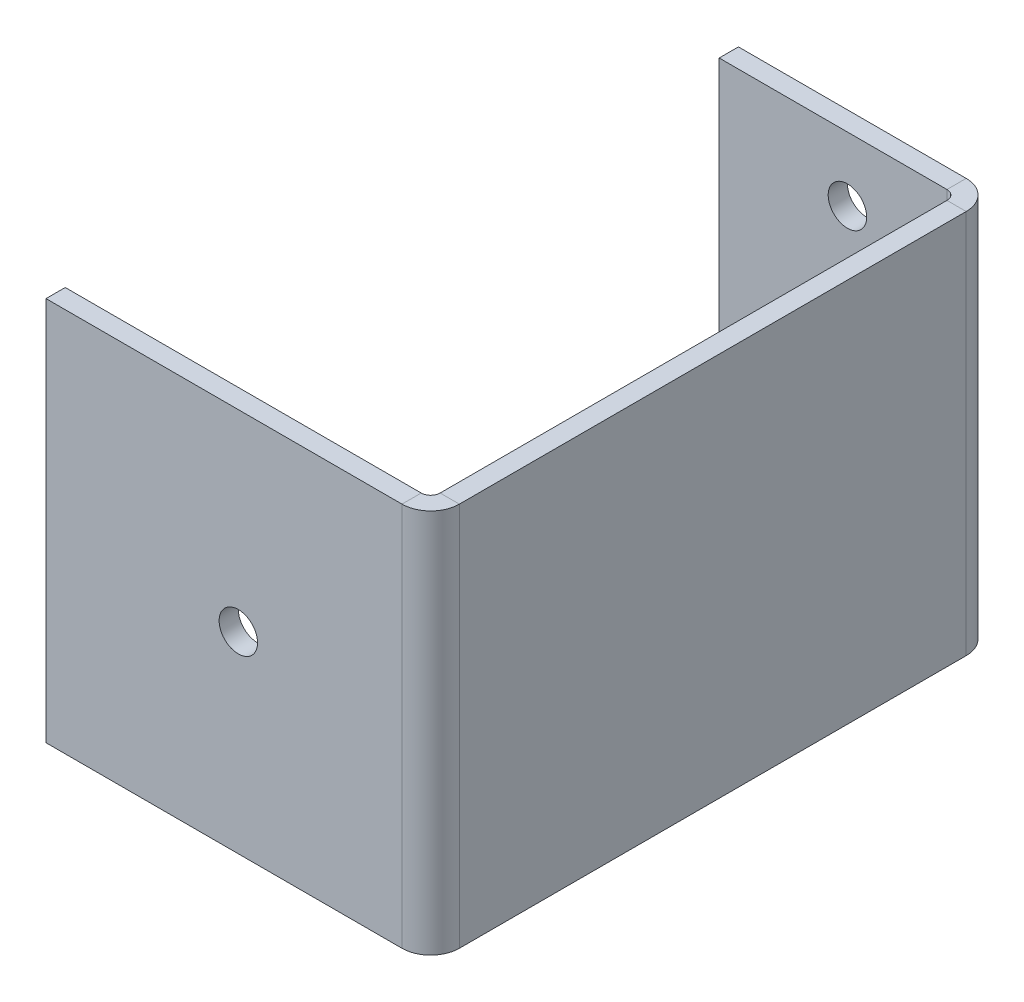
ISO-10303-21;
HEADER;
FILE_DESCRIPTION(('STEP AP214'),'2;1');
FILE_NAME('part.step','',(''),(''),'','','');
FILE_SCHEMA(('AUTOMOTIVE_DESIGN { 1 0 10303 214 1 1 1 1 }'));
ENDSEC;
DATA;
#1=APPLICATION_CONTEXT('core data for automotive mechanical design processes');
#2=APPLICATION_PROTOCOL_DEFINITION('international standard','automotive_design',2000,#1);
#3=PRODUCT_CONTEXT('',#1,'mechanical');
#4=PRODUCT('Part','Part','',(#3));
#5=PRODUCT_RELATED_PRODUCT_CATEGORY('part','',(#4));
#6=PRODUCT_DEFINITION_FORMATION('','',#4);
#7=PRODUCT_DEFINITION_CONTEXT('part definition',#1,'design');
#8=PRODUCT_DEFINITION('design','',#6,#7);
#9=PRODUCT_DEFINITION_SHAPE('','',#8);
#10=(LENGTH_UNIT() NAMED_UNIT(*) SI_UNIT(.MILLI.,.METRE.));
#11=(NAMED_UNIT(*) PLANE_ANGLE_UNIT() SI_UNIT($,.RADIAN.));
#12=(NAMED_UNIT(*) SI_UNIT($,.STERADIAN.) SOLID_ANGLE_UNIT());
#13=UNCERTAINTY_MEASURE_WITH_UNIT(LENGTH_MEASURE(1.E-05),#10,'distance_accuracy_value','');
#14=(GEOMETRIC_REPRESENTATION_CONTEXT(3) GLOBAL_UNCERTAINTY_ASSIGNED_CONTEXT((#13)) GLOBAL_UNIT_ASSIGNED_CONTEXT((#10,
#11,#12)) REPRESENTATION_CONTEXT('',''));
#15=CARTESIAN_POINT('',(0.,0.,0.));
#16=DIRECTION('',(0.,0.,1.));
#17=DIRECTION('',(1.,0.,0.));
#18=AXIS2_PLACEMENT_3D('',#15,#16,#17);
#19=CARTESIAN_POINT('',(20.,30.,2.2366));
#20=DIRECTION('',(0.,1.,0.));
#21=DIRECTION('',(0.,0.,1.));
#22=AXIS2_PLACEMENT_3D('',#19,#20,#21);
#23=PLANE('',#22);
#24=DIRECTION('',(-1.,0.,0.));
#25=VECTOR('',#24,1.);
#26=CARTESIAN_POINT('',(20.,30.,2.2366));
#27=LINE('',#26,#25);
#28=CARTESIAN_POINT('',(20.,30.,2.2366));
#29=VERTEX_POINT('',#28);
#30=CARTESIAN_POINT('',(18.5,30.,2.2366));
#31=VERTEX_POINT('',#30);
#32=EDGE_CURVE('E11',#29,#31,#27,.T.);
#33=ORIENTED_EDGE('',*,*,#32,.F.);
#34=CARTESIAN_POINT('',(17.7634,30.,2.2366));
#35=DIRECTION('',(0.,1.,0.));
#36=DIRECTION('',(0.,0.,1.));
#37=AXIS2_PLACEMENT_3D('',#34,#35,#36);
#38=CIRCLE('',#37,2.2366);
#39=CARTESIAN_POINT('',(17.7634,30.,0.));
#40=VERTEX_POINT('',#39);
#41=EDGE_CURVE('E247',#40,#29,#38,.F.);
#42=ORIENTED_EDGE('',*,*,#41,.F.);
#43=DIRECTION('',(0.,0.,-1.));
#44=VECTOR('',#43,1.);
#45=CARTESIAN_POINT('',(17.7634,30.,1.5));
#46=LINE('',#45,#44);
#47=CARTESIAN_POINT('',(17.7634,30.,1.5));
#48=VERTEX_POINT('',#47);
#49=EDGE_CURVE('E44',#48,#40,#46,.T.);
#50=ORIENTED_EDGE('',*,*,#49,.F.);
#51=CARTESIAN_POINT('',(17.7634,30.,2.2366));
#52=DIRECTION('',(0.,1.,0.));
#53=DIRECTION('',(1.,0.,0.));
#54=AXIS2_PLACEMENT_3D('',#51,#52,#53);
#55=CIRCLE('',#54,0.7366);
#56=EDGE_CURVE('E145',#48,#31,#55,.F.);
#57=ORIENTED_EDGE('',*,*,#56,.T.);
#58=EDGE_LOOP('',(#33,#42,#50,#57));
#59=FACE_BOUND('',#58,.T.);
#60=ADVANCED_FACE('F36',(#59),#23,.T.);
#61=CARTESIAN_POINT('',(17.7634,30.,1.5));
#62=DIRECTION('',(0.,1.,0.));
#63=DIRECTION('',(0.,0.,1.));
#64=AXIS2_PLACEMENT_3D('',#61,#62,#63);
#65=PLANE('',#64);
#66=DIRECTION('',(0.,0.,1.));
#67=VECTOR('',#66,1.);
#68=CARTESIAN_POINT('',(20.,30.,0.));
#69=LINE('',#68,#67);
#70=CARTESIAN_POINT('',(20.,30.,41.7634));
#71=VERTEX_POINT('',#70);
#72=EDGE_CURVE('E139',#29,#71,#69,.T.);
#73=ORIENTED_EDGE('',*,*,#72,.F.);
#74=ORIENTED_EDGE('',*,*,#32,.T.);
#75=DIRECTION('',(0.,0.,1.));
#76=VECTOR('',#75,1.);
#77=CARTESIAN_POINT('',(18.5,30.,0.));
#78=LINE('',#77,#76);
#79=CARTESIAN_POINT('',(18.5,30.,41.7634));
#80=VERTEX_POINT('',#79);
#81=EDGE_CURVE('E136',#31,#80,#78,.T.);
#82=ORIENTED_EDGE('',*,*,#81,.T.);
#83=DIRECTION('',(1.,0.,0.));
#84=VECTOR('',#83,1.);
#85=CARTESIAN_POINT('',(18.5,30.,41.7634));
#86=LINE('',#85,#84);
#87=EDGE_CURVE('E228',#80,#71,#86,.T.);
#88=ORIENTED_EDGE('',*,*,#87,.T.);
#89=EDGE_LOOP('',(#73,#74,#82,#88));
#90=FACE_BOUND('',#89,.T.);
#91=ADVANCED_FACE('F134',(#90),#65,.T.);
#92=CARTESIAN_POINT('',(17.7634,0.,0.));
#93=DIRECTION('',(0.,-1.,0.));
#94=DIRECTION('',(0.,0.,-1.));
#95=AXIS2_PLACEMENT_3D('',#92,#93,#94);
#96=PLANE('',#95);
#97=DIRECTION('',(0.,0.,1.));
#98=VECTOR('',#97,1.);
#99=CARTESIAN_POINT('',(17.7634,0.,0.));
#100=LINE('',#99,#98);
#101=CARTESIAN_POINT('',(17.7634,0.,0.));
#102=VERTEX_POINT('',#101);
#103=CARTESIAN_POINT('',(17.7634,0.,1.5));
#104=VERTEX_POINT('',#103);
#105=EDGE_CURVE('E233',#102,#104,#100,.T.);
#106=ORIENTED_EDGE('',*,*,#105,.F.);
#107=CARTESIAN_POINT('',(17.7634,0.,2.2366));
#108=DIRECTION('',(0.,1.,0.));
#109=DIRECTION('',(0.,0.,1.));
#110=AXIS2_PLACEMENT_3D('',#107,#108,#109);
#111=CIRCLE('',#110,2.2366);
#112=CARTESIAN_POINT('',(20.,0.,2.2366));
#113=VERTEX_POINT('',#112);
#114=EDGE_CURVE('E185',#102,#113,#111,.F.);
#115=ORIENTED_EDGE('',*,*,#114,.T.);
#116=DIRECTION('',(1.,0.,0.));
#117=VECTOR('',#116,1.);
#118=CARTESIAN_POINT('',(18.5,0.,2.2366));
#119=LINE('',#118,#117);
#120=CARTESIAN_POINT('',(18.5,0.,2.2366));
#121=VERTEX_POINT('',#120);
#122=EDGE_CURVE('E231',#121,#113,#119,.T.);
#123=ORIENTED_EDGE('',*,*,#122,.F.);
#124=CARTESIAN_POINT('',(17.7634,0.,2.2366));
#125=DIRECTION('',(0.,1.,0.));
#126=DIRECTION('',(1.,0.,0.));
#127=AXIS2_PLACEMENT_3D('',#124,#125,#126);
#128=CIRCLE('',#127,0.7366);
#129=EDGE_CURVE('E157',#104,#121,#128,.F.);
#130=ORIENTED_EDGE('',*,*,#129,.F.);
#131=EDGE_LOOP('',(#106,#115,#123,#130));
#132=FACE_BOUND('',#131,.T.);
#133=ADVANCED_FACE('F307',(#132),#96,.T.);
#134=CARTESIAN_POINT('',(18.5,0.,2.2366));
#135=DIRECTION('',(0.,-1.,0.));
#136=DIRECTION('',(0.,0.,-1.));
#137=AXIS2_PLACEMENT_3D('',#134,#135,#136);
#138=PLANE('',#137);
#139=DIRECTION('',(1.,0.,0.));
#140=VECTOR('',#139,1.);
#141=CARTESIAN_POINT('',(0.,0.,0.));
#142=LINE('',#141,#140);
#143=CARTESIAN_POINT('',(0.,0.,0.));
#144=VERTEX_POINT('',#143);
#145=EDGE_CURVE('E188',#144,#102,#142,.T.);
#146=ORIENTED_EDGE('',*,*,#145,.T.);
#147=ORIENTED_EDGE('',*,*,#105,.T.);
#148=DIRECTION('',(1.,0.,0.));
#149=VECTOR('',#148,1.);
#150=CARTESIAN_POINT('',(0.,0.,1.5));
#151=LINE('',#150,#149);
#152=CARTESIAN_POINT('',(0.,0.,1.5));
#153=VERTEX_POINT('',#152);
#154=EDGE_CURVE('E194',#153,#104,#151,.T.);
#155=ORIENTED_EDGE('',*,*,#154,.F.);
#156=DIRECTION('',(0.,0.,-1.));
#157=VECTOR('',#156,1.);
#158=CARTESIAN_POINT('',(0.,0.,1.5));
#159=LINE('',#158,#157);
#160=EDGE_CURVE('E191',#153,#144,#159,.T.);
#161=ORIENTED_EDGE('',*,*,#160,.T.);
#162=EDGE_LOOP('',(#146,#147,#155,#161));
#163=FACE_BOUND('',#162,.T.);
#164=ADVANCED_FACE('F310',(#163),#138,.T.);
#165=CARTESIAN_POINT('',(17.7634,30.,44.));
#166=DIRECTION('',(0.,1.,0.));
#167=DIRECTION('',(0.,0.,1.));
#168=AXIS2_PLACEMENT_3D('',#165,#166,#167);
#169=PLANE('',#168);
#170=DIRECTION('',(0.,0.,-1.));
#171=VECTOR('',#170,1.);
#172=CARTESIAN_POINT('',(17.7634,30.,44.));
#173=LINE('',#172,#171);
#174=CARTESIAN_POINT('',(17.7634,30.,44.));
#175=VERTEX_POINT('',#174);
#176=CARTESIAN_POINT('',(17.7634,30.,42.5));
#177=VERTEX_POINT('',#176);
#178=EDGE_CURVE('E52',#175,#177,#173,.T.);
#179=ORIENTED_EDGE('',*,*,#178,.F.);
#180=CARTESIAN_POINT('',(17.7634,30.,41.7634));
#181=DIRECTION('',(0.,1.,0.));
#182=DIRECTION('',(0.,0.,1.));
#183=AXIS2_PLACEMENT_3D('',#180,#181,#182);
#184=CIRCLE('',#183,2.2366);
#185=EDGE_CURVE('E257',#71,#175,#184,.F.);
#186=ORIENTED_EDGE('',*,*,#185,.F.);
#187=ORIENTED_EDGE('',*,*,#87,.F.);
#188=CARTESIAN_POINT('',(17.7634,30.,41.7634));
#189=DIRECTION('',(0.,1.,0.));
#190=DIRECTION('',(1.,0.,0.));
#191=AXIS2_PLACEMENT_3D('',#188,#189,#190);
#192=CIRCLE('',#191,0.7366);
#193=EDGE_CURVE('E165',#80,#177,#192,.F.);
#194=ORIENTED_EDGE('',*,*,#193,.T.);
#195=EDGE_LOOP('',(#179,#186,#187,#194));
#196=FACE_BOUND('',#195,.T.);
#197=ADVANCED_FACE('F337',(#196),#169,.T.);
#198=CARTESIAN_POINT('',(18.5,30.,41.7634));
#199=DIRECTION('',(0.,1.,0.));
#200=DIRECTION('',(0.,0.,1.));
#201=AXIS2_PLACEMENT_3D('',#198,#199,#200);
#202=PLANE('',#201);
#203=DIRECTION('',(-1.,0.,0.));
#204=VECTOR('',#203,1.);
#205=CARTESIAN_POINT('',(20.,30.,44.));
#206=LINE('',#205,#204);
#207=CARTESIAN_POINT('',(-9.99999999999998,30.,44.));
#208=VERTEX_POINT('',#207);
#209=EDGE_CURVE('E260',#175,#208,#206,.T.);
#210=ORIENTED_EDGE('',*,*,#209,.F.);
#211=ORIENTED_EDGE('',*,*,#178,.T.);
#212=DIRECTION('',(-1.,0.,0.));
#213=VECTOR('',#212,1.);
#214=CARTESIAN_POINT('',(20.,30.,42.5));
#215=LINE('',#214,#213);
#216=CARTESIAN_POINT('',(-9.99999999999998,30.,42.5));
#217=VERTEX_POINT('',#216);
#218=EDGE_CURVE('E106',#177,#217,#215,.T.);
#219=ORIENTED_EDGE('',*,*,#218,.T.);
#220=DIRECTION('',(0.,0.,-1.));
#221=VECTOR('',#220,1.);
#222=CARTESIAN_POINT('',(-9.99999999999998,30.,44.));
#223=LINE('',#222,#221);
#224=EDGE_CURVE('E263',#208,#217,#223,.T.);
#225=ORIENTED_EDGE('',*,*,#224,.F.);
#226=EDGE_LOOP('',(#210,#211,#219,#225));
#227=FACE_BOUND('',#226,.T.);
#228=ADVANCED_FACE('F340',(#227),#202,.T.);
#229=CARTESIAN_POINT('',(20.,0.,41.7634));
#230=DIRECTION('',(0.,-1.,0.));
#231=DIRECTION('',(0.,0.,-1.));
#232=AXIS2_PLACEMENT_3D('',#229,#230,#231);
#233=PLANE('',#232);
#234=DIRECTION('',(-1.,0.,0.));
#235=VECTOR('',#234,1.);
#236=CARTESIAN_POINT('',(20.,0.,41.7634));
#237=LINE('',#236,#235);
#238=CARTESIAN_POINT('',(20.,0.,41.7634));
#239=VERTEX_POINT('',#238);
#240=CARTESIAN_POINT('',(18.5,0.,41.7634));
#241=VERTEX_POINT('',#240);
#242=EDGE_CURVE('E93',#239,#241,#237,.T.);
#243=ORIENTED_EDGE('',*,*,#242,.F.);
#244=CARTESIAN_POINT('',(17.7634,0.,41.7634));
#245=DIRECTION('',(0.,1.,0.));
#246=DIRECTION('',(0.,0.,1.));
#247=AXIS2_PLACEMENT_3D('',#244,#245,#246);
#248=CIRCLE('',#247,2.2366);
#249=CARTESIAN_POINT('',(17.7634,0.,44.));
#250=VERTEX_POINT('',#249);
#251=EDGE_CURVE('E181',#239,#250,#248,.F.);
#252=ORIENTED_EDGE('',*,*,#251,.T.);
#253=DIRECTION('',(0.,0.,1.));
#254=VECTOR('',#253,1.);
#255=CARTESIAN_POINT('',(17.7634,0.,42.5));
#256=LINE('',#255,#254);
#257=CARTESIAN_POINT('',(17.7634,0.,42.5));
#258=VERTEX_POINT('',#257);
#259=EDGE_CURVE('E100',#258,#250,#256,.T.);
#260=ORIENTED_EDGE('',*,*,#259,.F.);
#261=CARTESIAN_POINT('',(17.7634,0.,41.7634));
#262=DIRECTION('',(0.,1.,0.));
#263=DIRECTION('',(1.,0.,0.));
#264=AXIS2_PLACEMENT_3D('',#261,#262,#263);
#265=CIRCLE('',#264,0.7366);
#266=EDGE_CURVE('E200',#241,#258,#265,.F.);
#267=ORIENTED_EDGE('',*,*,#266,.F.);
#268=EDGE_LOOP('',(#243,#252,#260,#267));
#269=FACE_BOUND('',#268,.T.);
#270=ADVANCED_FACE('F298',(#269),#233,.T.);
#271=CARTESIAN_POINT('',(17.7634,0.,42.5));
#272=DIRECTION('',(0.,-1.,0.));
#273=DIRECTION('',(0.,0.,-1.));
#274=AXIS2_PLACEMENT_3D('',#271,#272,#273);
#275=PLANE('',#274);
#276=DIRECTION('',(0.,0.,1.));
#277=VECTOR('',#276,1.);
#278=CARTESIAN_POINT('',(20.,0.,0.));
#279=LINE('',#278,#277);
#280=EDGE_CURVE('E183',#113,#239,#279,.T.);
#281=ORIENTED_EDGE('',*,*,#280,.T.);
#282=ORIENTED_EDGE('',*,*,#242,.T.);
#283=DIRECTION('',(0.,0.,1.));
#284=VECTOR('',#283,1.);
#285=CARTESIAN_POINT('',(18.5,0.,0.));
#286=LINE('',#285,#284);
#287=EDGE_CURVE('E198',#121,#241,#286,.T.);
#288=ORIENTED_EDGE('',*,*,#287,.F.);
#289=ORIENTED_EDGE('',*,*,#122,.T.);
#290=EDGE_LOOP('',(#281,#282,#288,#289));
#291=FACE_BOUND('',#290,.T.);
#292=ADVANCED_FACE('F303',(#291),#275,.T.);
#293=CARTESIAN_POINT('',(20.,30.,42.5));
#294=DIRECTION('',(0.,0.,1.));
#295=DIRECTION('',(1.,0.,0.));
#296=AXIS2_PLACEMENT_3D('',#293,#294,#295);
#297=PLANE('',#296);
#298=CARTESIAN_POINT('',(5.00000000000001,15.,42.5));
#299=DIRECTION('',(0.,0.,1.));
#300=DIRECTION('',(1.,0.,0.));
#301=AXIS2_PLACEMENT_3D('',#298,#299,#300);
#302=CIRCLE('',#301,1.49999999999999);
#303=CARTESIAN_POINT('',(6.50000000000001,15.,42.5));
#304=VERTEX_POINT('',#303);
#305=EDGE_CURVE('E278',#304,#304,#302,.T.);
#306=ORIENTED_EDGE('',*,*,#305,.T.);
#307=EDGE_LOOP('',(#306));
#308=FACE_BOUND('',#307,.T.);
#309=DIRECTION('',(-1.,0.,0.));
#310=VECTOR('',#309,1.);
#311=CARTESIAN_POINT('',(20.,0.,42.5));
#312=LINE('',#311,#310);
#313=CARTESIAN_POINT('',(-9.99999999999998,0.,42.5));
#314=VERTEX_POINT('',#313);
#315=EDGE_CURVE('E171',#258,#314,#312,.T.);
#316=ORIENTED_EDGE('',*,*,#315,.T.);
#317=DIRECTION('',(0.,-1.,0.));
#318=VECTOR('',#317,1.);
#319=CARTESIAN_POINT('',(-9.99999999999998,30.,42.5));
#320=LINE('',#319,#318);
#321=EDGE_CURVE('E224',#217,#314,#320,.T.);
#322=ORIENTED_EDGE('',*,*,#321,.F.);
#323=ORIENTED_EDGE('',*,*,#218,.F.);
#324=DIRECTION('',(0.,-1.,0.));
#325=VECTOR('',#324,1.);
#326=CARTESIAN_POINT('',(17.7634,30.,42.5));
#327=LINE('',#326,#325);
#328=EDGE_CURVE('E167',#177,#258,#327,.T.);
#329=ORIENTED_EDGE('',*,*,#328,.T.);
#330=EDGE_LOOP('',(#316,#322,#323,#329));
#331=FACE_BOUND('',#330,.T.);
#332=ADVANCED_FACE('F348',(#308,#331),#297,.F.);
#333=CARTESIAN_POINT('',(-9.99999999999998,30.,44.));
#334=DIRECTION('',(-1.,0.,0.));
#335=DIRECTION('',(0.,0.,1.));
#336=AXIS2_PLACEMENT_3D('',#333,#334,#335);
#337=PLANE('',#336);
#338=DIRECTION('',(0.,0.,-1.));
#339=VECTOR('',#338,1.);
#340=CARTESIAN_POINT('',(-9.99999999999998,0.,44.));
#341=LINE('',#340,#339);
#342=CARTESIAN_POINT('',(-9.99999999999998,0.,44.));
#343=VERTEX_POINT('',#342);
#344=EDGE_CURVE('E174',#343,#314,#341,.T.);
#345=ORIENTED_EDGE('',*,*,#344,.F.);
#346=DIRECTION('',(0.,-1.,0.));
#347=VECTOR('',#346,1.);
#348=CARTESIAN_POINT('',(-9.99999999999998,30.,44.));
#349=LINE('',#348,#347);
#350=EDGE_CURVE('E222',#208,#343,#349,.T.);
#351=ORIENTED_EDGE('',*,*,#350,.F.);
#352=ORIENTED_EDGE('',*,*,#224,.T.);
#353=ORIENTED_EDGE('',*,*,#321,.T.);
#354=EDGE_LOOP('',(#345,#351,#352,#353));
#355=FACE_BOUND('',#354,.T.);
#356=ADVANCED_FACE('F291',(#355),#337,.T.);
#357=CARTESIAN_POINT('',(20.,30.,44.));
#358=DIRECTION('',(0.,0.,1.));
#359=DIRECTION('',(1.,0.,0.));
#360=AXIS2_PLACEMENT_3D('',#357,#358,#359);
#361=PLANE('',#360);
#362=CARTESIAN_POINT('',(5.00000000000001,15.,44.));
#363=DIRECTION('',(0.,0.,1.));
#364=DIRECTION('',(1.,0.,0.));
#365=AXIS2_PLACEMENT_3D('',#362,#363,#364);
#366=CIRCLE('',#365,1.49999999999999);
#367=CARTESIAN_POINT('',(6.5,15.,44.));
#368=VERTEX_POINT('',#367);
#369=EDGE_CURVE('E281',#368,#368,#366,.T.);
#370=ORIENTED_EDGE('',*,*,#369,.F.);
#371=EDGE_LOOP('',(#370));
#372=FACE_BOUND('',#371,.T.);
#373=DIRECTION('',(-1.,0.,0.));
#374=VECTOR('',#373,1.);
#375=CARTESIAN_POINT('',(20.,0.,44.));
#376=LINE('',#375,#374);
#377=EDGE_CURVE('E178',#250,#343,#376,.T.);
#378=ORIENTED_EDGE('',*,*,#377,.F.);
#379=DIRECTION('',(0.,-1.,0.));
#380=VECTOR('',#379,1.);
#381=CARTESIAN_POINT('',(17.7634,30.,44.));
#382=LINE('',#381,#380);
#383=EDGE_CURVE('E219',#175,#250,#382,.T.);
#384=ORIENTED_EDGE('',*,*,#383,.F.);
#385=ORIENTED_EDGE('',*,*,#209,.T.);
#386=ORIENTED_EDGE('',*,*,#350,.T.);
#387=EDGE_LOOP('',(#378,#384,#385,#386));
#388=FACE_BOUND('',#387,.T.);
#389=ADVANCED_FACE('F287',(#372,#388),#361,.T.);
#390=CARTESIAN_POINT('',(17.7634,30.,41.7634));
#391=DIRECTION('',(0.,-1.,0.));
#392=DIRECTION('',(0.,0.,-1.));
#393=AXIS2_PLACEMENT_3D('',#390,#391,#392);
#394=CYLINDRICAL_SURFACE('',#393,2.2366);
#395=ORIENTED_EDGE('',*,*,#251,.F.);
#396=DIRECTION('',(0.,-1.,0.));
#397=VECTOR('',#396,1.);
#398=CARTESIAN_POINT('',(20.,30.,41.7634));
#399=LINE('',#398,#397);
#400=EDGE_CURVE('E216',#71,#239,#399,.T.);
#401=ORIENTED_EDGE('',*,*,#400,.F.);
#402=ORIENTED_EDGE('',*,*,#185,.T.);
#403=ORIENTED_EDGE('',*,*,#383,.T.);
#404=EDGE_LOOP('',(#395,#401,#402,#403));
#405=FACE_BOUND('',#404,.T.);
#406=ADVANCED_FACE('F290',(#405),#394,.T.);
#407=CARTESIAN_POINT('',(20.,30.,0.));
#408=DIRECTION('',(1.,0.,0.));
#409=DIRECTION('',(0.,0.,-1.));
#410=AXIS2_PLACEMENT_3D('',#407,#408,#409);
#411=PLANE('',#410);
#412=ORIENTED_EDGE('',*,*,#280,.F.);
#413=DIRECTION('',(0.,-1.,0.));
#414=VECTOR('',#413,1.);
#415=CARTESIAN_POINT('',(20.,30.,2.2366));
#416=LINE('',#415,#414);
#417=EDGE_CURVE('E213',#29,#113,#416,.T.);
#418=ORIENTED_EDGE('',*,*,#417,.F.);
#419=ORIENTED_EDGE('',*,*,#72,.T.);
#420=ORIENTED_EDGE('',*,*,#400,.T.);
#421=EDGE_LOOP('',(#412,#418,#419,#420));
#422=FACE_BOUND('',#421,.T.);
#423=ADVANCED_FACE('F305',(#422),#411,.T.);
#424=CARTESIAN_POINT('',(17.7634,30.,2.2366));
#425=DIRECTION('',(0.,-1.,0.));
#426=DIRECTION('',(0.,0.,-1.));
#427=AXIS2_PLACEMENT_3D('',#424,#425,#426);
#428=CYLINDRICAL_SURFACE('',#427,2.2366);
#429=ORIENTED_EDGE('',*,*,#114,.F.);
#430=DIRECTION('',(0.,-1.,0.));
#431=VECTOR('',#430,1.);
#432=CARTESIAN_POINT('',(17.7634,30.,0.));
#433=LINE('',#432,#431);
#434=EDGE_CURVE('E210',#40,#102,#433,.T.);
#435=ORIENTED_EDGE('',*,*,#434,.F.);
#436=ORIENTED_EDGE('',*,*,#41,.T.);
#437=ORIENTED_EDGE('',*,*,#417,.T.);
#438=EDGE_LOOP('',(#429,#435,#436,#437));
#439=FACE_BOUND('',#438,.T.);
#440=ADVANCED_FACE('F246',(#439),#428,.T.);
#441=CARTESIAN_POINT('',(0.,30.,0.));
#442=DIRECTION('',(0.,0.,-1.));
#443=DIRECTION('',(-1.,0.,0.));
#444=AXIS2_PLACEMENT_3D('',#441,#442,#443);
#445=PLANE('',#444);
#446=CARTESIAN_POINT('',(10.,25.,0.));
#447=DIRECTION('',(0.,0.,-1.));
#448=DIRECTION('',(-1.,0.,0.));
#449=AXIS2_PLACEMENT_3D('',#446,#447,#448);
#450=CIRCLE('',#449,1.5);
#451=CARTESIAN_POINT('',(8.5,25.,0.));
#452=VERTEX_POINT('',#451);
#453=EDGE_CURVE('E275',#452,#452,#450,.T.);
#454=ORIENTED_EDGE('',*,*,#453,.F.);
#455=EDGE_LOOP('',(#454));
#456=FACE_BOUND('',#455,.T.);
#457=CARTESIAN_POINT('',(10.,5.,0.));
#458=DIRECTION('',(0.,0.,-1.));
#459=DIRECTION('',(-1.,0.,0.));
#460=AXIS2_PLACEMENT_3D('',#457,#458,#459);
#461=CIRCLE('',#460,1.5);
#462=CARTESIAN_POINT('',(8.5,5.,0.));
#463=VERTEX_POINT('',#462);
#464=EDGE_CURVE('E269',#463,#463,#461,.T.);
#465=ORIENTED_EDGE('',*,*,#464,.F.);
#466=EDGE_LOOP('',(#465));
#467=FACE_BOUND('',#466,.T.);
#468=ORIENTED_EDGE('',*,*,#145,.F.);
#469=DIRECTION('',(0.,-1.,0.));
#470=VECTOR('',#469,1.);
#471=CARTESIAN_POINT('',(0.,30.,0.));
#472=LINE('',#471,#470);
#473=CARTESIAN_POINT('',(0.,30.,0.));
#474=VERTEX_POINT('',#473);
#475=EDGE_CURVE('E208',#474,#144,#472,.T.);
#476=ORIENTED_EDGE('',*,*,#475,.F.);
#477=DIRECTION('',(1.,0.,0.));
#478=VECTOR('',#477,1.);
#479=CARTESIAN_POINT('',(0.,30.,0.));
#480=LINE('',#479,#478);
#481=EDGE_CURVE('E240',#474,#40,#480,.T.);
#482=ORIENTED_EDGE('',*,*,#481,.T.);
#483=ORIENTED_EDGE('',*,*,#434,.T.);
#484=EDGE_LOOP('',(#468,#476,#482,#483));
#485=FACE_BOUND('',#484,.T.);
#486=ADVANCED_FACE('F251',(#456,#467,#485),#445,.T.);
#487=CARTESIAN_POINT('',(0.,30.,1.5));
#488=DIRECTION('',(-1.,0.,0.));
#489=DIRECTION('',(0.,0.,1.));
#490=AXIS2_PLACEMENT_3D('',#487,#488,#489);
#491=PLANE('',#490);
#492=ORIENTED_EDGE('',*,*,#160,.F.);
#493=DIRECTION('',(0.,-1.,0.));
#494=VECTOR('',#493,1.);
#495=CARTESIAN_POINT('',(0.,30.,1.5));
#496=LINE('',#495,#494);
#497=CARTESIAN_POINT('',(0.,30.,1.5));
#498=VERTEX_POINT('',#497);
#499=EDGE_CURVE('E206',#498,#153,#496,.T.);
#500=ORIENTED_EDGE('',*,*,#499,.F.);
#501=DIRECTION('',(0.,0.,-1.));
#502=VECTOR('',#501,1.);
#503=CARTESIAN_POINT('',(0.,30.,1.5));
#504=LINE('',#503,#502);
#505=EDGE_CURVE('E252',#498,#474,#504,.T.);
#506=ORIENTED_EDGE('',*,*,#505,.T.);
#507=ORIENTED_EDGE('',*,*,#475,.T.);
#508=EDGE_LOOP('',(#492,#500,#506,#507));
#509=FACE_BOUND('',#508,.T.);
#510=ADVANCED_FACE('F315',(#509),#491,.T.);
#511=CARTESIAN_POINT('',(0.,30.,1.5));
#512=DIRECTION('',(0.,0.,-1.));
#513=DIRECTION('',(-1.,0.,0.));
#514=AXIS2_PLACEMENT_3D('',#511,#512,#513);
#515=PLANE('',#514);
#516=CARTESIAN_POINT('',(10.,25.,1.5));
#517=DIRECTION('',(0.,0.,-1.));
#518=DIRECTION('',(-1.,0.,0.));
#519=AXIS2_PLACEMENT_3D('',#516,#517,#518);
#520=CIRCLE('',#519,1.5);
#521=CARTESIAN_POINT('',(8.5,25.,1.5));
#522=VERTEX_POINT('',#521);
#523=EDGE_CURVE('E272',#522,#522,#520,.T.);
#524=ORIENTED_EDGE('',*,*,#523,.T.);
#525=EDGE_LOOP('',(#524));
#526=FACE_BOUND('',#525,.T.);
#527=CARTESIAN_POINT('',(10.,5.,1.5));
#528=DIRECTION('',(0.,0.,-1.));
#529=DIRECTION('',(-1.,0.,0.));
#530=AXIS2_PLACEMENT_3D('',#527,#528,#529);
#531=CIRCLE('',#530,1.5);
#532=CARTESIAN_POINT('',(8.5,5.,1.5));
#533=VERTEX_POINT('',#532);
#534=EDGE_CURVE('E175',#533,#533,#531,.T.);
#535=ORIENTED_EDGE('',*,*,#534,.T.);
#536=EDGE_LOOP('',(#535));
#537=FACE_BOUND('',#536,.T.);
#538=ORIENTED_EDGE('',*,*,#154,.T.);
#539=DIRECTION('',(0.,-1.,0.));
#540=VECTOR('',#539,1.);
#541=CARTESIAN_POINT('',(17.7634,30.,1.5));
#542=LINE('',#541,#540);
#543=EDGE_CURVE('E159',#48,#104,#542,.T.);
#544=ORIENTED_EDGE('',*,*,#543,.F.);
#545=DIRECTION('',(1.,0.,0.));
#546=VECTOR('',#545,1.);
#547=CARTESIAN_POINT('',(0.,30.,1.5));
#548=LINE('',#547,#546);
#549=EDGE_CURVE('E150',#498,#48,#548,.T.);
#550=ORIENTED_EDGE('',*,*,#549,.F.);
#551=ORIENTED_EDGE('',*,*,#499,.T.);
#552=EDGE_LOOP('',(#538,#544,#550,#551));
#553=FACE_BOUND('',#552,.T.);
#554=ADVANCED_FACE('F313',(#526,#537,#553),#515,.F.);
#555=CARTESIAN_POINT('',(17.7634,30.,2.2366));
#556=DIRECTION('',(0.,-1.,0.));
#557=DIRECTION('',(0.,0.,-1.));
#558=AXIS2_PLACEMENT_3D('',#555,#556,#557);
#559=CYLINDRICAL_SURFACE('',#558,0.7366);
#560=ORIENTED_EDGE('',*,*,#129,.T.);
#561=DIRECTION('',(0.,-1.,0.));
#562=VECTOR('',#561,1.);
#563=CARTESIAN_POINT('',(18.5,30.,2.2366));
#564=LINE('',#563,#562);
#565=EDGE_CURVE('E154',#31,#121,#564,.T.);
#566=ORIENTED_EDGE('',*,*,#565,.F.);
#567=ORIENTED_EDGE('',*,*,#56,.F.);
#568=ORIENTED_EDGE('',*,*,#543,.T.);
#569=EDGE_LOOP('',(#560,#566,#567,#568));
#570=FACE_BOUND('',#569,.T.);
#571=ADVANCED_FACE('F155',(#570),#559,.F.);
#572=CARTESIAN_POINT('',(18.5,30.,0.));
#573=DIRECTION('',(1.,0.,0.));
#574=DIRECTION('',(0.,0.,-1.));
#575=AXIS2_PLACEMENT_3D('',#572,#573,#574);
#576=PLANE('',#575);
#577=ORIENTED_EDGE('',*,*,#287,.T.);
#578=DIRECTION('',(0.,-1.,0.));
#579=VECTOR('',#578,1.);
#580=CARTESIAN_POINT('',(18.5,30.,41.7634));
#581=LINE('',#580,#579);
#582=EDGE_CURVE('E160',#80,#241,#581,.T.);
#583=ORIENTED_EDGE('',*,*,#582,.F.);
#584=ORIENTED_EDGE('',*,*,#81,.F.);
#585=ORIENTED_EDGE('',*,*,#565,.T.);
#586=EDGE_LOOP('',(#577,#583,#584,#585));
#587=FACE_BOUND('',#586,.T.);
#588=ADVANCED_FACE('F162',(#587),#576,.F.);
#589=CARTESIAN_POINT('',(17.7634,30.,41.7634));
#590=DIRECTION('',(0.,-1.,0.));
#591=DIRECTION('',(0.,0.,-1.));
#592=AXIS2_PLACEMENT_3D('',#589,#590,#591);
#593=CYLINDRICAL_SURFACE('',#592,0.7366);
#594=ORIENTED_EDGE('',*,*,#266,.T.);
#595=ORIENTED_EDGE('',*,*,#328,.F.);
#596=ORIENTED_EDGE('',*,*,#193,.F.);
#597=ORIENTED_EDGE('',*,*,#582,.T.);
#598=EDGE_LOOP('',(#594,#595,#596,#597));
#599=FACE_BOUND('',#598,.T.);
#600=ADVANCED_FACE('F439',(#599),#593,.F.);
#601=CARTESIAN_POINT('',(17.7634,30.,41.7634));
#602=DIRECTION('',(0.,1.,0.));
#603=DIRECTION('',(1.,0.,0.));
#604=AXIS2_PLACEMENT_3D('',#601,#602,#603);
#605=PLANE('',#604);
#606=ORIENTED_EDGE('',*,*,#549,.T.);
#607=ORIENTED_EDGE('',*,*,#49,.T.);
#608=ORIENTED_EDGE('',*,*,#481,.F.);
#609=ORIENTED_EDGE('',*,*,#505,.F.);
#610=EDGE_LOOP('',(#606,#607,#608,#609));
#611=FACE_BOUND('',#610,.T.);
#612=ADVANCED_FACE('F237',(#611),#605,.T.);
#613=CARTESIAN_POINT('',(17.7634,0.,41.7634));
#614=DIRECTION('',(0.,1.,0.));
#615=DIRECTION('',(1.,0.,0.));
#616=AXIS2_PLACEMENT_3D('',#613,#614,#615);
#617=PLANE('',#616);
#618=ORIENTED_EDGE('',*,*,#315,.F.);
#619=ORIENTED_EDGE('',*,*,#259,.T.);
#620=ORIENTED_EDGE('',*,*,#377,.T.);
#621=ORIENTED_EDGE('',*,*,#344,.T.);
#622=EDGE_LOOP('',(#618,#619,#620,#621));
#623=FACE_BOUND('',#622,.T.);
#624=ADVANCED_FACE('F376',(#623),#617,.F.);
#625=CARTESIAN_POINT('',(10.,5.,0.));
#626=DIRECTION('',(0.,0.,-1.));
#627=DIRECTION('',(-1.,0.,0.));
#628=AXIS2_PLACEMENT_3D('',#625,#626,#627);
#629=CYLINDRICAL_SURFACE('',#628,1.5);
#630=ORIENTED_EDGE('',*,*,#534,.F.);
#631=EDGE_LOOP('',(#630));
#632=FACE_BOUND('',#631,.T.);
#633=ORIENTED_EDGE('',*,*,#464,.T.);
#634=EDGE_LOOP('',(#633));
#635=FACE_BOUND('',#634,.T.);
#636=ADVANCED_FACE('F390',(#632,#635),#629,.F.);
#637=CARTESIAN_POINT('',(10.,25.,0.));
#638=DIRECTION('',(0.,0.,-1.));
#639=DIRECTION('',(-1.,0.,0.));
#640=AXIS2_PLACEMENT_3D('',#637,#638,#639);
#641=CYLINDRICAL_SURFACE('',#640,1.5);
#642=ORIENTED_EDGE('',*,*,#523,.F.);
#643=EDGE_LOOP('',(#642));
#644=FACE_BOUND('',#643,.T.);
#645=ORIENTED_EDGE('',*,*,#453,.T.);
#646=EDGE_LOOP('',(#645));
#647=FACE_BOUND('',#646,.T.);
#648=ADVANCED_FACE('F395',(#644,#647),#641,.F.);
#649=CARTESIAN_POINT('',(5.00000000000001,15.,44.));
#650=DIRECTION('',(0.,0.,1.));
#651=DIRECTION('',(1.,0.,0.));
#652=AXIS2_PLACEMENT_3D('',#649,#650,#651);
#653=CYLINDRICAL_SURFACE('',#652,1.49999999999999);
#654=ORIENTED_EDGE('',*,*,#305,.F.);
#655=EDGE_LOOP('',(#654));
#656=FACE_BOUND('',#655,.T.);
#657=ORIENTED_EDGE('',*,*,#369,.T.);
#658=EDGE_LOOP('',(#657));
#659=FACE_BOUND('',#658,.T.);
#660=ADVANCED_FACE('F285',(#656,#659),#653,.F.);
#661=CLOSED_SHELL('',(#60,#91,#133,#164,#197,#228,#270,#292,#332,#356,#389,#406,#423,#440,#486,
#510,#554,#571,#588,#600,#612,#624,#636,#648,#660));
#662=MANIFOLD_SOLID_BREP('B2',#661);
#663=ADVANCED_BREP_SHAPE_REPRESENTATION('',(#18,#662),#14);
#664=SHAPE_DEFINITION_REPRESENTATION(#9,#663);
ENDSEC;
END-ISO-10303-21;
